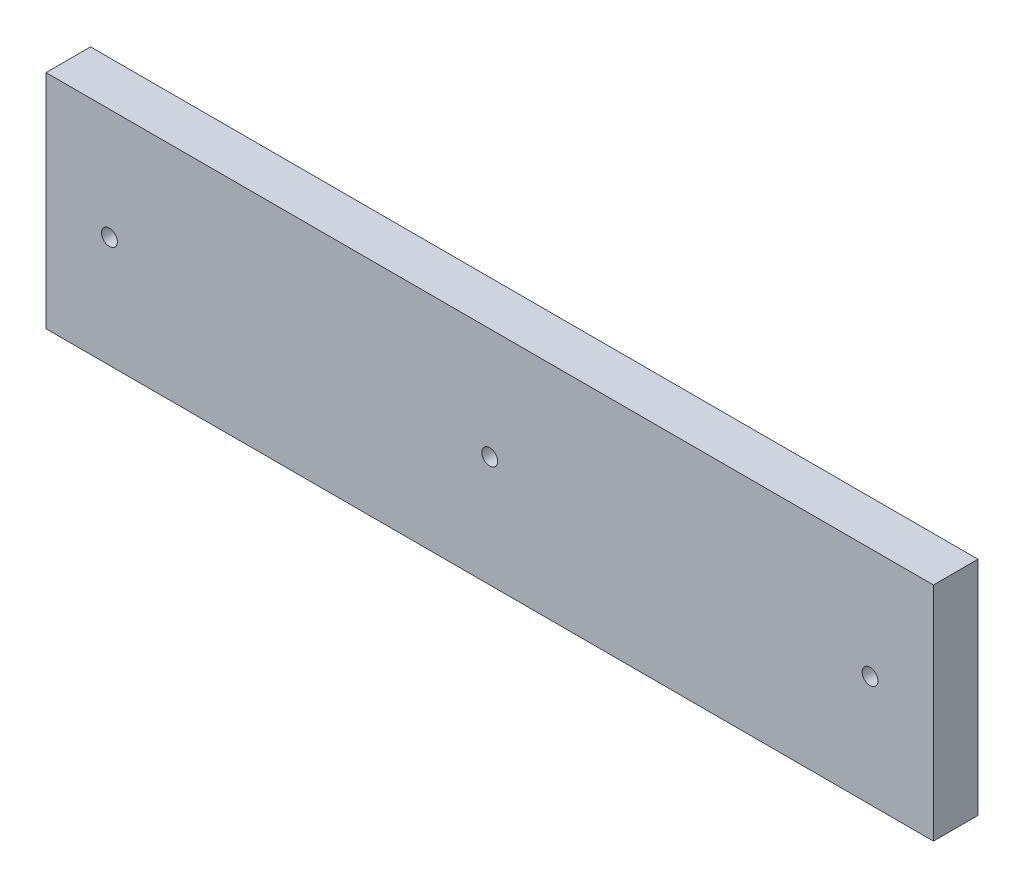
ISO-10303-21;
HEADER;
FILE_DESCRIPTION(('STEP AP214'),'2;1');
FILE_NAME('part.step','',(''),(''),'','','');
FILE_SCHEMA(('AUTOMOTIVE_DESIGN { 1 0 10303 214 1 1 1 1 }'));
ENDSEC;
DATA;
#1=APPLICATION_CONTEXT('core data for automotive mechanical design processes');
#2=APPLICATION_PROTOCOL_DEFINITION('international standard','automotive_design',2000,#1);
#3=PRODUCT_CONTEXT('',#1,'mechanical');
#4=PRODUCT('Part','Part','',(#3));
#5=PRODUCT_RELATED_PRODUCT_CATEGORY('part','',(#4));
#6=PRODUCT_DEFINITION_FORMATION('','',#4);
#7=PRODUCT_DEFINITION_CONTEXT('part definition',#1,'design');
#8=PRODUCT_DEFINITION('design','',#6,#7);
#9=PRODUCT_DEFINITION_SHAPE('','',#8);
#10=(LENGTH_UNIT() NAMED_UNIT(*) SI_UNIT(.MILLI.,.METRE.));
#11=(NAMED_UNIT(*) PLANE_ANGLE_UNIT() SI_UNIT($,.RADIAN.));
#12=(NAMED_UNIT(*) SI_UNIT($,.STERADIAN.) SOLID_ANGLE_UNIT());
#13=UNCERTAINTY_MEASURE_WITH_UNIT(LENGTH_MEASURE(1.E-05),#10,'distance_accuracy_value','');
#14=(GEOMETRIC_REPRESENTATION_CONTEXT(3) GLOBAL_UNCERTAINTY_ASSIGNED_CONTEXT((#13)) GLOBAL_UNIT_ASSIGNED_CONTEXT((#10,
#11,#12)) REPRESENTATION_CONTEXT('',''));
#15=CARTESIAN_POINT('',(0.,0.,0.));
#16=DIRECTION('',(0.,0.,1.));
#17=DIRECTION('',(1.,0.,0.));
#18=AXIS2_PLACEMENT_3D('',#15,#16,#17);
#19=CARTESIAN_POINT('',(0.,0.,17.8562));
#20=DIRECTION('',(0.,0.,-1.));
#21=DIRECTION('',(-1.,0.,0.));
#22=AXIS2_PLACEMENT_3D('',#19,#20,#21);
#23=PLANE('',#22);
#24=DIRECTION('',(0.,-1.,0.));
#25=VECTOR('',#24,1.);
#26=CARTESIAN_POINT('',(-177.8,44.45,17.8562));
#27=LINE('',#26,#25);
#28=CARTESIAN_POINT('',(-177.8,44.45,17.8562));
#29=VERTEX_POINT('',#28);
#30=CARTESIAN_POINT('',(-177.8,-44.45,17.8562));
#31=VERTEX_POINT('',#30);
#32=EDGE_CURVE('E87',#29,#31,#27,.T.);
#33=ORIENTED_EDGE('',*,*,#32,.T.);
#34=DIRECTION('',(1.,0.,0.));
#35=VECTOR('',#34,1.);
#36=CARTESIAN_POINT('',(177.8,-44.45,17.8562));
#37=LINE('',#36,#35);
#38=CARTESIAN_POINT('',(177.8,-44.45,17.8562));
#39=VERTEX_POINT('',#38);
#40=EDGE_CURVE('E82',#31,#39,#37,.T.);
#41=ORIENTED_EDGE('',*,*,#40,.T.);
#42=DIRECTION('',(0.,1.,0.));
#43=VECTOR('',#42,1.);
#44=CARTESIAN_POINT('',(177.8,44.45,17.8562));
#45=LINE('',#44,#43);
#46=CARTESIAN_POINT('',(177.8,44.45,17.8562));
#47=VERTEX_POINT('',#46);
#48=EDGE_CURVE('E85',#39,#47,#45,.T.);
#49=ORIENTED_EDGE('',*,*,#48,.T.);
#50=DIRECTION('',(-1.,0.,0.));
#51=VECTOR('',#50,1.);
#52=CARTESIAN_POINT('',(177.8,44.45,17.8562));
#53=LINE('',#52,#51);
#54=EDGE_CURVE('E52',#47,#29,#53,.T.);
#55=ORIENTED_EDGE('',*,*,#54,.T.);
#56=EDGE_LOOP('',(#33,#41,#49,#55));
#57=FACE_BOUND('',#56,.T.);
#58=CARTESIAN_POINT('',(-152.4,0.,17.8562));
#59=DIRECTION('',(0.,0.,1.));
#60=DIRECTION('',(1.,0.,0.));
#61=AXIS2_PLACEMENT_3D('',#58,#59,#60);
#62=CIRCLE('',#61,3.175);
#63=CARTESIAN_POINT('',(-149.225,0.,17.8562));
#64=VERTEX_POINT('',#63);
#65=EDGE_CURVE('E102',#64,#64,#62,.T.);
#66=ORIENTED_EDGE('',*,*,#65,.F.);
#67=EDGE_LOOP('',(#66));
#68=FACE_BOUND('',#67,.T.);
#69=CARTESIAN_POINT('',(0.,0.,17.8562));
#70=DIRECTION('',(0.,0.,1.));
#71=DIRECTION('',(1.,0.,0.));
#72=AXIS2_PLACEMENT_3D('',#69,#70,#71);
#73=CIRCLE('',#72,3.175);
#74=CARTESIAN_POINT('',(3.17499999999992,0.,17.8562));
#75=VERTEX_POINT('',#74);
#76=EDGE_CURVE('E117',#75,#75,#73,.T.);
#77=ORIENTED_EDGE('',*,*,#76,.F.);
#78=EDGE_LOOP('',(#77));
#79=FACE_BOUND('',#78,.T.);
#80=CARTESIAN_POINT('',(152.4,0.,17.8562));
#81=DIRECTION('',(0.,0.,1.));
#82=DIRECTION('',(1.,0.,0.));
#83=AXIS2_PLACEMENT_3D('',#80,#81,#82);
#84=CIRCLE('',#83,3.175);
#85=CARTESIAN_POINT('',(155.575,0.,17.8562));
#86=VERTEX_POINT('',#85);
#87=EDGE_CURVE('E123',#86,#86,#84,.T.);
#88=ORIENTED_EDGE('',*,*,#87,.F.);
#89=EDGE_LOOP('',(#88));
#90=FACE_BOUND('',#89,.T.);
#91=ADVANCED_FACE('F35',(#57,#68,#79,#90),#23,.F.);
#92=CARTESIAN_POINT('',(0.,0.,0.));
#93=DIRECTION('',(0.,0.,-1.));
#94=DIRECTION('',(-1.,0.,0.));
#95=AXIS2_PLACEMENT_3D('',#92,#93,#94);
#96=PLANE('',#95);
#97=CARTESIAN_POINT('',(0.,0.,0.));
#98=DIRECTION('',(0.,0.,1.));
#99=DIRECTION('',(1.,0.,0.));
#100=AXIS2_PLACEMENT_3D('',#97,#98,#99);
#101=CIRCLE('',#100,3.175);
#102=CARTESIAN_POINT('',(3.17499999999992,0.,0.));
#103=VERTEX_POINT('',#102);
#104=EDGE_CURVE('E120',#103,#103,#101,.T.);
#105=ORIENTED_EDGE('',*,*,#104,.T.);
#106=EDGE_LOOP('',(#105));
#107=FACE_BOUND('',#106,.T.);
#108=DIRECTION('',(0.,-1.,0.));
#109=VECTOR('',#108,1.);
#110=CARTESIAN_POINT('',(-177.8,44.45,0.));
#111=LINE('',#110,#109);
#112=CARTESIAN_POINT('',(-177.8,44.45,0.));
#113=VERTEX_POINT('',#112);
#114=CARTESIAN_POINT('',(-177.8,-44.45,0.));
#115=VERTEX_POINT('',#114);
#116=EDGE_CURVE('E99',#113,#115,#111,.T.);
#117=ORIENTED_EDGE('',*,*,#116,.F.);
#118=DIRECTION('',(-1.,0.,0.));
#119=VECTOR('',#118,1.);
#120=CARTESIAN_POINT('',(177.8,44.45,0.));
#121=LINE('',#120,#119);
#122=CARTESIAN_POINT('',(177.8,44.45,0.));
#123=VERTEX_POINT('',#122);
#124=EDGE_CURVE('E75',#123,#113,#121,.T.);
#125=ORIENTED_EDGE('',*,*,#124,.F.);
#126=DIRECTION('',(0.,1.,0.));
#127=VECTOR('',#126,1.);
#128=CARTESIAN_POINT('',(177.8,44.45,0.));
#129=LINE('',#128,#127);
#130=CARTESIAN_POINT('',(177.8,-44.45,0.));
#131=VERTEX_POINT('',#130);
#132=EDGE_CURVE('E69',#131,#123,#129,.T.);
#133=ORIENTED_EDGE('',*,*,#132,.F.);
#134=DIRECTION('',(1.,0.,0.));
#135=VECTOR('',#134,1.);
#136=CARTESIAN_POINT('',(177.8,-44.45,0.));
#137=LINE('',#136,#135);
#138=EDGE_CURVE('E91',#115,#131,#137,.T.);
#139=ORIENTED_EDGE('',*,*,#138,.F.);
#140=EDGE_LOOP('',(#117,#125,#133,#139));
#141=FACE_BOUND('',#140,.T.);
#142=CARTESIAN_POINT('',(-152.4,0.,0.));
#143=DIRECTION('',(0.,0.,1.));
#144=DIRECTION('',(1.,0.,0.));
#145=AXIS2_PLACEMENT_3D('',#142,#143,#144);
#146=CIRCLE('',#145,3.175);
#147=CARTESIAN_POINT('',(-149.225,0.,0.));
#148=VERTEX_POINT('',#147);
#149=EDGE_CURVE('E114',#148,#148,#146,.T.);
#150=ORIENTED_EDGE('',*,*,#149,.T.);
#151=EDGE_LOOP('',(#150));
#152=FACE_BOUND('',#151,.T.);
#153=CARTESIAN_POINT('',(152.4,0.,0.));
#154=DIRECTION('',(0.,0.,1.));
#155=DIRECTION('',(1.,0.,0.));
#156=AXIS2_PLACEMENT_3D('',#153,#154,#155);
#157=CIRCLE('',#156,3.175);
#158=CARTESIAN_POINT('',(155.575,0.,0.));
#159=VERTEX_POINT('',#158);
#160=EDGE_CURVE('E126',#159,#159,#157,.T.);
#161=ORIENTED_EDGE('',*,*,#160,.T.);
#162=EDGE_LOOP('',(#161));
#163=FACE_BOUND('',#162,.T.);
#164=ADVANCED_FACE('F110',(#107,#141,#152,#163),#96,.T.);
#165=CARTESIAN_POINT('',(-177.8,44.45,17.8562));
#166=DIRECTION('',(1.,0.,0.));
#167=DIRECTION('',(0.,0.,-1.));
#168=AXIS2_PLACEMENT_3D('',#165,#166,#167);
#169=PLANE('',#168);
#170=ORIENTED_EDGE('',*,*,#116,.T.);
#171=DIRECTION('',(0.,0.,-1.));
#172=VECTOR('',#171,1.);
#173=CARTESIAN_POINT('',(-177.8,-44.45,17.8562));
#174=LINE('',#173,#172);
#175=EDGE_CURVE('E11',#31,#115,#174,.T.);
#176=ORIENTED_EDGE('',*,*,#175,.F.);
#177=ORIENTED_EDGE('',*,*,#32,.F.);
#178=DIRECTION('',(0.,0.,-1.));
#179=VECTOR('',#178,1.);
#180=CARTESIAN_POINT('',(-177.8,44.45,17.8562));
#181=LINE('',#180,#179);
#182=EDGE_CURVE('E95',#29,#113,#181,.T.);
#183=ORIENTED_EDGE('',*,*,#182,.T.);
#184=EDGE_LOOP('',(#170,#176,#177,#183));
#185=FACE_BOUND('',#184,.T.);
#186=ADVANCED_FACE('F37',(#185),#169,.F.);
#187=CARTESIAN_POINT('',(177.8,-44.45,17.8562));
#188=DIRECTION('',(0.,1.,0.));
#189=DIRECTION('',(-1.,0.,0.));
#190=AXIS2_PLACEMENT_3D('',#187,#188,#189);
#191=PLANE('',#190);
#192=ORIENTED_EDGE('',*,*,#138,.T.);
#193=DIRECTION('',(0.,0.,-1.));
#194=VECTOR('',#193,1.);
#195=CARTESIAN_POINT('',(177.8,-44.45,17.8562));
#196=LINE('',#195,#194);
#197=EDGE_CURVE('E44',#39,#131,#196,.T.);
#198=ORIENTED_EDGE('',*,*,#197,.F.);
#199=ORIENTED_EDGE('',*,*,#40,.F.);
#200=ORIENTED_EDGE('',*,*,#175,.T.);
#201=EDGE_LOOP('',(#192,#198,#199,#200));
#202=FACE_BOUND('',#201,.T.);
#203=ADVANCED_FACE('F90',(#202),#191,.F.);
#204=CARTESIAN_POINT('',(177.8,44.45,17.8562));
#205=DIRECTION('',(-1.,0.,0.));
#206=DIRECTION('',(0.,0.,1.));
#207=AXIS2_PLACEMENT_3D('',#204,#205,#206);
#208=PLANE('',#207);
#209=ORIENTED_EDGE('',*,*,#132,.T.);
#210=DIRECTION('',(0.,0.,-1.));
#211=VECTOR('',#210,1.);
#212=CARTESIAN_POINT('',(177.8,44.45,17.8562));
#213=LINE('',#212,#211);
#214=EDGE_CURVE('E92',#47,#123,#213,.T.);
#215=ORIENTED_EDGE('',*,*,#214,.F.);
#216=ORIENTED_EDGE('',*,*,#48,.F.);
#217=ORIENTED_EDGE('',*,*,#197,.T.);
#218=EDGE_LOOP('',(#209,#215,#216,#217));
#219=FACE_BOUND('',#218,.T.);
#220=ADVANCED_FACE('F93',(#219),#208,.F.);
#221=CARTESIAN_POINT('',(177.8,44.45,17.8562));
#222=DIRECTION('',(0.,-1.,0.));
#223=DIRECTION('',(1.,0.,0.));
#224=AXIS2_PLACEMENT_3D('',#221,#222,#223);
#225=PLANE('',#224);
#226=ORIENTED_EDGE('',*,*,#124,.T.);
#227=ORIENTED_EDGE('',*,*,#182,.F.);
#228=ORIENTED_EDGE('',*,*,#54,.F.);
#229=ORIENTED_EDGE('',*,*,#214,.T.);
#230=EDGE_LOOP('',(#226,#227,#228,#229));
#231=FACE_BOUND('',#230,.T.);
#232=ADVANCED_FACE('F107',(#231),#225,.F.);
#233=CARTESIAN_POINT('',(-152.4,0.,17.8562));
#234=DIRECTION('',(0.,0.,-1.));
#235=DIRECTION('',(-1.,0.,0.));
#236=AXIS2_PLACEMENT_3D('',#233,#234,#235);
#237=CYLINDRICAL_SURFACE('',#236,3.175);
#238=ORIENTED_EDGE('',*,*,#65,.T.);
#239=EDGE_LOOP('',(#238));
#240=FACE_BOUND('',#239,.T.);
#241=ORIENTED_EDGE('',*,*,#149,.F.);
#242=EDGE_LOOP('',(#241));
#243=FACE_BOUND('',#242,.T.);
#244=ADVANCED_FACE('F143',(#240,#243),#237,.F.);
#245=CARTESIAN_POINT('',(0.,0.,17.8562));
#246=DIRECTION('',(0.,0.,-1.));
#247=DIRECTION('',(-1.,0.,0.));
#248=AXIS2_PLACEMENT_3D('',#245,#246,#247);
#249=CYLINDRICAL_SURFACE('',#248,3.175);
#250=ORIENTED_EDGE('',*,*,#76,.T.);
#251=EDGE_LOOP('',(#250));
#252=FACE_BOUND('',#251,.T.);
#253=ORIENTED_EDGE('',*,*,#104,.F.);
#254=EDGE_LOOP('',(#253));
#255=FACE_BOUND('',#254,.T.);
#256=ADVANCED_FACE('F189',(#252,#255),#249,.F.);
#257=CARTESIAN_POINT('',(152.4,0.,17.8562));
#258=DIRECTION('',(0.,0.,-1.));
#259=DIRECTION('',(-1.,0.,0.));
#260=AXIS2_PLACEMENT_3D('',#257,#258,#259);
#261=CYLINDRICAL_SURFACE('',#260,3.175);
#262=ORIENTED_EDGE('',*,*,#87,.T.);
#263=EDGE_LOOP('',(#262));
#264=FACE_BOUND('',#263,.T.);
#265=ORIENTED_EDGE('',*,*,#160,.F.);
#266=EDGE_LOOP('',(#265));
#267=FACE_BOUND('',#266,.T.);
#268=ADVANCED_FACE('F132',(#264,#267),#261,.F.);
#269=CLOSED_SHELL('',(#91,#164,#186,#203,#220,#232,#244,#256,#268));
#270=MANIFOLD_SOLID_BREP('B2',#269);
#271=ADVANCED_BREP_SHAPE_REPRESENTATION('',(#18,#270),#14);
#272=SHAPE_DEFINITION_REPRESENTATION(#9,#271);
ENDSEC;
END-ISO-10303-21;
